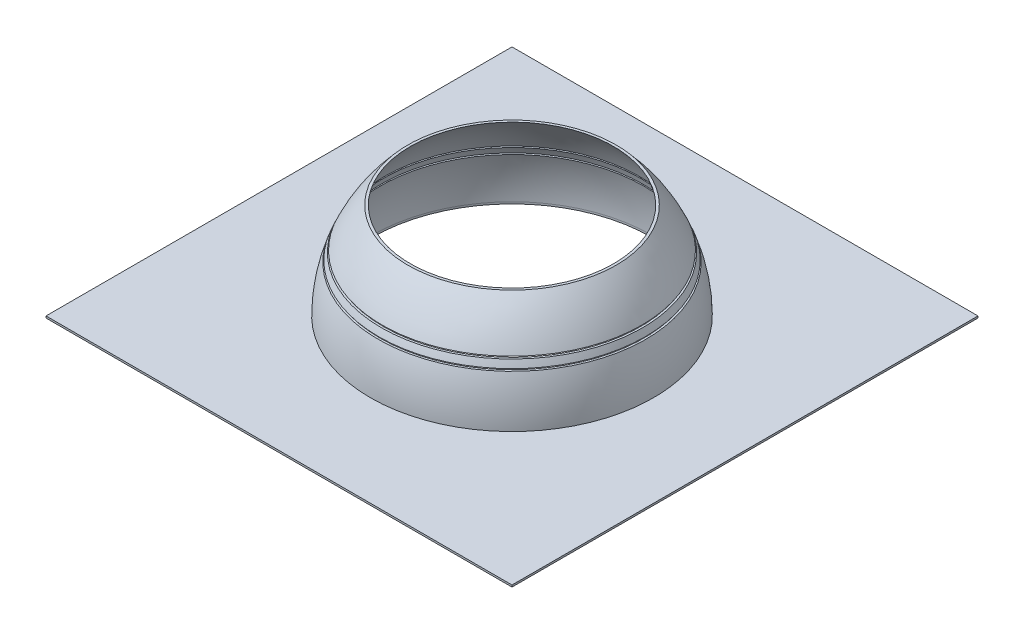
ISO-10303-21;
HEADER;
FILE_DESCRIPTION(('STEP AP214'),'2;1');
FILE_NAME('part.step','',(''),(''),'','','');
FILE_SCHEMA(('AUTOMOTIVE_DESIGN { 1 0 10303 214 1 1 1 1 }'));
ENDSEC;
DATA;
#1=APPLICATION_CONTEXT('core data for automotive mechanical design processes');
#2=APPLICATION_PROTOCOL_DEFINITION('international standard','automotive_design',2000,#1);
#3=PRODUCT_CONTEXT('',#1,'mechanical');
#4=PRODUCT('Part','Part','',(#3));
#5=PRODUCT_RELATED_PRODUCT_CATEGORY('part','',(#4));
#6=PRODUCT_DEFINITION_FORMATION('','',#4);
#7=PRODUCT_DEFINITION_CONTEXT('part definition',#1,'design');
#8=PRODUCT_DEFINITION('design','',#6,#7);
#9=PRODUCT_DEFINITION_SHAPE('','',#8);
#10=(LENGTH_UNIT() NAMED_UNIT(*) SI_UNIT(.MILLI.,.METRE.));
#11=(NAMED_UNIT(*) PLANE_ANGLE_UNIT() SI_UNIT($,.RADIAN.));
#12=(NAMED_UNIT(*) SI_UNIT($,.STERADIAN.) SOLID_ANGLE_UNIT());
#13=UNCERTAINTY_MEASURE_WITH_UNIT(LENGTH_MEASURE(1.E-05),#10,'distance_accuracy_value','');
#14=(GEOMETRIC_REPRESENTATION_CONTEXT(3) GLOBAL_UNCERTAINTY_ASSIGNED_CONTEXT((#13)) GLOBAL_UNIT_ASSIGNED_CONTEXT((#10,
#11,#12)) REPRESENTATION_CONTEXT('',''));
#15=CARTESIAN_POINT('',(0.,0.,0.));
#16=DIRECTION('',(0.,0.,1.));
#17=DIRECTION('',(1.,0.,0.));
#18=AXIS2_PLACEMENT_3D('',#15,#16,#17);
#19=CARTESIAN_POINT('',(0.,0.,0.));
#20=DIRECTION('',(0.,1.,0.));
#21=DIRECTION('',(-1.,0.,0.));
#22=AXIS2_PLACEMENT_3D('',#19,#20,#21);
#23=SPHERICAL_SURFACE('',#22,150.);
#24=CARTESIAN_POINT('',(0.,50.,0.));
#25=DIRECTION('',(0.,-1.,0.));
#26=DIRECTION('',(0.,0.,-1.));
#27=AXIS2_PLACEMENT_3D('',#24,#25,#26);
#28=CIRCLE('',#27,141.42135623731);
#29=CARTESIAN_POINT('',(0.,50.,-141.42135623731));
#30=VERTEX_POINT('',#29);
#31=EDGE_CURVE('E118',#30,#30,#28,.T.);
#32=ORIENTED_EDGE('',*,*,#31,.F.);
#33=EDGE_LOOP('',(#32));
#34=FACE_BOUND('',#33,.T.);
#35=CARTESIAN_POINT('',(0.,0.,0.));
#36=DIRECTION('',(0.,-1.,0.));
#37=DIRECTION('',(0.,0.,-1.));
#38=AXIS2_PLACEMENT_3D('',#35,#36,#37);
#39=CIRCLE('',#38,150.);
#40=CARTESIAN_POINT('',(0.,0.,150.));
#41=VERTEX_POINT('',#40);
#42=EDGE_CURVE('E125',#41,#41,#39,.T.);
#43=ORIENTED_EDGE('',*,*,#42,.T.);
#44=EDGE_LOOP('',(#43));
#45=FACE_BOUND('',#44,.T.);
#46=ADVANCED_FACE('F55',(#34,#45),#23,.F.);
#47=CARTESIAN_POINT('',(-228.314893880117,50.,-250.));
#48=DIRECTION('',(0.,-1.,0.));
#49=DIRECTION('',(0.,0.,-1.));
#50=AXIS2_PLACEMENT_3D('',#47,#48,#49);
#51=PLANE('',#50);
#52=CARTESIAN_POINT('',(0.,50.,0.));
#53=DIRECTION('',(0.,-1.,0.));
#54=DIRECTION('',(0.,0.,-1.));
#55=AXIS2_PLACEMENT_3D('',#52,#53,#54);
#56=CIRCLE('',#55,143.540934927985);
#57=CARTESIAN_POINT('',(0.,50.,-143.540934927985));
#58=VERTEX_POINT('',#57);
#59=EDGE_CURVE('E116',#58,#58,#56,.F.);
#60=ORIENTED_EDGE('',*,*,#59,.T.);
#61=EDGE_LOOP('',(#60));
#62=FACE_BOUND('',#61,.T.);
#63=ORIENTED_EDGE('',*,*,#31,.T.);
#64=EDGE_LOOP('',(#63));
#65=FACE_BOUND('',#64,.T.);
#66=ADVANCED_FACE('F162',(#62,#65),#51,.F.);
#67=CARTESIAN_POINT('',(0.,0.,0.));
#68=DIRECTION('',(0.,1.,0.));
#69=DIRECTION('',(1.,0.,0.));
#70=AXIS2_PLACEMENT_3D('',#67,#68,#69);
#71=SPHERICAL_SURFACE('',#70,152.);
#72=ORIENTED_EDGE('',*,*,#59,.F.);
#73=EDGE_LOOP('',(#72));
#74=FACE_BOUND('',#73,.T.);
#75=CARTESIAN_POINT('',(0.,0.,0.));
#76=DIRECTION('',(0.,1.,0.));
#77=DIRECTION('',(0.,0.,1.));
#78=AXIS2_PLACEMENT_3D('',#75,#76,#77);
#79=CIRCLE('',#78,152.);
#80=CARTESIAN_POINT('',(0.,0.,152.));
#81=VERTEX_POINT('',#80);
#82=EDGE_CURVE('E122',#81,#81,#79,.T.);
#83=ORIENTED_EDGE('',*,*,#82,.T.);
#84=EDGE_LOOP('',(#83));
#85=FACE_BOUND('',#84,.T.);
#86=ADVANCED_FACE('F57',(#74,#85),#71,.T.);
#87=CARTESIAN_POINT('',(0.,0.,0.));
#88=DIRECTION('',(0.,1.,0.));
#89=DIRECTION('',(0.,0.,1.));
#90=AXIS2_PLACEMENT_3D('',#87,#88,#89);
#91=PLANE('',#90);
#92=ORIENTED_EDGE('',*,*,#82,.F.);
#93=EDGE_LOOP('',(#92));
#94=FACE_BOUND('',#93,.T.);
#95=DIRECTION('',(0.,0.,-1.));
#96=VECTOR('',#95,1.);
#97=CARTESIAN_POINT('',(250.,0.,-250.));
#98=LINE('',#97,#96);
#99=CARTESIAN_POINT('',(250.,0.,250.));
#100=VERTEX_POINT('',#99);
#101=CARTESIAN_POINT('',(250.,0.,-250.));
#102=VERTEX_POINT('',#101);
#103=EDGE_CURVE('E134',#100,#102,#98,.T.);
#104=ORIENTED_EDGE('',*,*,#103,.T.);
#105=DIRECTION('',(-1.,0.,0.));
#106=VECTOR('',#105,1.);
#107=CARTESIAN_POINT('',(-250.,0.,-250.));
#108=LINE('',#107,#106);
#109=CARTESIAN_POINT('',(-250.,0.,-250.));
#110=VERTEX_POINT('',#109);
#111=EDGE_CURVE('E99',#102,#110,#108,.T.);
#112=ORIENTED_EDGE('',*,*,#111,.T.);
#113=DIRECTION('',(0.,0.,1.));
#114=VECTOR('',#113,1.);
#115=CARTESIAN_POINT('',(-250.,0.,-250.));
#116=LINE('',#115,#114);
#117=CARTESIAN_POINT('',(-250.,0.,250.));
#118=VERTEX_POINT('',#117);
#119=EDGE_CURVE('E141',#110,#118,#116,.T.);
#120=ORIENTED_EDGE('',*,*,#119,.T.);
#121=DIRECTION('',(1.,0.,0.));
#122=VECTOR('',#121,1.);
#123=CARTESIAN_POINT('',(-250.,0.,250.));
#124=LINE('',#123,#122);
#125=EDGE_CURVE('E107',#118,#100,#124,.T.);
#126=ORIENTED_EDGE('',*,*,#125,.T.);
#127=EDGE_LOOP('',(#104,#112,#120,#126));
#128=FACE_BOUND('',#127,.T.);
#129=ADVANCED_FACE('F151',(#94,#128),#91,.T.);
#130=CARTESIAN_POINT('',(0.,-2.,0.));
#131=DIRECTION('',(0.,1.,0.));
#132=DIRECTION('',(0.,0.,1.));
#133=AXIS2_PLACEMENT_3D('',#130,#131,#132);
#134=PLANE('',#133);
#135=CARTESIAN_POINT('',(0.,-2.,0.));
#136=DIRECTION('',(0.,1.,0.));
#137=DIRECTION('',(0.,0.,1.));
#138=AXIS2_PLACEMENT_3D('',#135,#136,#137);
#139=CIRCLE('',#138,150.);
#140=CARTESIAN_POINT('',(0.,-2.,150.));
#141=VERTEX_POINT('',#140);
#142=EDGE_CURVE('E59',#141,#141,#139,.F.);
#143=ORIENTED_EDGE('',*,*,#142,.F.);
#144=EDGE_LOOP('',(#143));
#145=FACE_BOUND('',#144,.T.);
#146=DIRECTION('',(0.,0.,-1.));
#147=VECTOR('',#146,1.);
#148=CARTESIAN_POINT('',(250.,-2.,-250.));
#149=LINE('',#148,#147);
#150=CARTESIAN_POINT('',(250.,-2.,250.));
#151=VERTEX_POINT('',#150);
#152=CARTESIAN_POINT('',(250.,-2.,-250.));
#153=VERTEX_POINT('',#152);
#154=EDGE_CURVE('E65',#151,#153,#149,.T.);
#155=ORIENTED_EDGE('',*,*,#154,.F.);
#156=DIRECTION('',(1.,0.,0.));
#157=VECTOR('',#156,1.);
#158=CARTESIAN_POINT('',(-250.,-2.,250.));
#159=LINE('',#158,#157);
#160=CARTESIAN_POINT('',(-250.,-2.,250.));
#161=VERTEX_POINT('',#160);
#162=EDGE_CURVE('E113',#161,#151,#159,.T.);
#163=ORIENTED_EDGE('',*,*,#162,.F.);
#164=DIRECTION('',(0.,0.,1.));
#165=VECTOR('',#164,1.);
#166=CARTESIAN_POINT('',(-250.,-2.,-250.));
#167=LINE('',#166,#165);
#168=CARTESIAN_POINT('',(-250.,-2.,-250.));
#169=VERTEX_POINT('',#168);
#170=EDGE_CURVE('E106',#169,#161,#167,.T.);
#171=ORIENTED_EDGE('',*,*,#170,.F.);
#172=DIRECTION('',(-1.,0.,0.));
#173=VECTOR('',#172,1.);
#174=CARTESIAN_POINT('',(-250.,-2.,-250.));
#175=LINE('',#174,#173);
#176=EDGE_CURVE('E97',#153,#169,#175,.T.);
#177=ORIENTED_EDGE('',*,*,#176,.F.);
#178=EDGE_LOOP('',(#155,#163,#171,#177));
#179=FACE_BOUND('',#178,.T.);
#180=ADVANCED_FACE('F103',(#145,#179),#134,.F.);
#181=CARTESIAN_POINT('',(-250.,-2.,-250.));
#182=DIRECTION('',(0.,0.,-1.));
#183=DIRECTION('',(-1.,0.,0.));
#184=AXIS2_PLACEMENT_3D('',#181,#182,#183);
#185=PLANE('',#184);
#186=ORIENTED_EDGE('',*,*,#111,.F.);
#187=DIRECTION('',(0.,1.,0.));
#188=VECTOR('',#187,1.);
#189=CARTESIAN_POINT('',(250.,-2.,-250.));
#190=LINE('',#189,#188);
#191=EDGE_CURVE('E12',#153,#102,#190,.T.);
#192=ORIENTED_EDGE('',*,*,#191,.F.);
#193=ORIENTED_EDGE('',*,*,#176,.T.);
#194=DIRECTION('',(0.,1.,0.));
#195=VECTOR('',#194,1.);
#196=CARTESIAN_POINT('',(-250.,-2.,-250.));
#197=LINE('',#196,#195);
#198=EDGE_CURVE('E90',#169,#110,#197,.T.);
#199=ORIENTED_EDGE('',*,*,#198,.T.);
#200=EDGE_LOOP('',(#186,#192,#193,#199));
#201=FACE_BOUND('',#200,.T.);
#202=ADVANCED_FACE('F96',(#201),#185,.T.);
#203=CARTESIAN_POINT('',(-250.,-2.,-250.));
#204=DIRECTION('',(-1.,0.,0.));
#205=DIRECTION('',(0.,0.,1.));
#206=AXIS2_PLACEMENT_3D('',#203,#204,#205);
#207=PLANE('',#206);
#208=ORIENTED_EDGE('',*,*,#119,.F.);
#209=ORIENTED_EDGE('',*,*,#198,.F.);
#210=ORIENTED_EDGE('',*,*,#170,.T.);
#211=DIRECTION('',(0.,1.,0.));
#212=VECTOR('',#211,1.);
#213=CARTESIAN_POINT('',(-250.,-2.,250.));
#214=LINE('',#213,#212);
#215=EDGE_CURVE('E137',#161,#118,#214,.T.);
#216=ORIENTED_EDGE('',*,*,#215,.T.);
#217=EDGE_LOOP('',(#208,#209,#210,#216));
#218=FACE_BOUND('',#217,.T.);
#219=ADVANCED_FACE('F146',(#218),#207,.T.);
#220=CARTESIAN_POINT('',(-250.,-2.,250.));
#221=DIRECTION('',(0.,0.,1.));
#222=DIRECTION('',(1.,0.,0.));
#223=AXIS2_PLACEMENT_3D('',#220,#221,#222);
#224=PLANE('',#223);
#225=ORIENTED_EDGE('',*,*,#125,.F.);
#226=ORIENTED_EDGE('',*,*,#215,.F.);
#227=ORIENTED_EDGE('',*,*,#162,.T.);
#228=DIRECTION('',(0.,1.,0.));
#229=VECTOR('',#228,1.);
#230=CARTESIAN_POINT('',(250.,-2.,250.));
#231=LINE('',#230,#229);
#232=EDGE_CURVE('E111',#151,#100,#231,.T.);
#233=ORIENTED_EDGE('',*,*,#232,.T.);
#234=EDGE_LOOP('',(#225,#226,#227,#233));
#235=FACE_BOUND('',#234,.T.);
#236=ADVANCED_FACE('F149',(#235),#224,.T.);
#237=CARTESIAN_POINT('',(250.,-2.,-250.));
#238=DIRECTION('',(1.,0.,0.));
#239=DIRECTION('',(0.,0.,-1.));
#240=AXIS2_PLACEMENT_3D('',#237,#238,#239);
#241=PLANE('',#240);
#242=ORIENTED_EDGE('',*,*,#103,.F.);
#243=ORIENTED_EDGE('',*,*,#232,.F.);
#244=ORIENTED_EDGE('',*,*,#154,.T.);
#245=ORIENTED_EDGE('',*,*,#191,.T.);
#246=EDGE_LOOP('',(#242,#243,#244,#245));
#247=FACE_BOUND('',#246,.T.);
#248=ADVANCED_FACE('F109',(#247),#241,.T.);
#249=CARTESIAN_POINT('',(0.,-2.000012,0.));
#250=DIRECTION('',(0.,1.,0.));
#251=DIRECTION('',(0.,0.,1.));
#252=AXIS2_PLACEMENT_3D('',#249,#250,#251);
#253=CYLINDRICAL_SURFACE('',#252,150.);
#254=CARTESIAN_POINT('',(0.,0.,150.));
#255=CARTESIAN_POINT('',(0.,-0.0208333333333333,150.));
#256=CARTESIAN_POINT('',(0.,-0.0416666666666666,150.));
#257=CARTESIAN_POINT('',(0.,-0.0833333333333332,150.));
#258=CARTESIAN_POINT('',(0.,-0.104166666666667,150.));
#259=CARTESIAN_POINT('',(0.,-0.145833333333333,150.));
#260=CARTESIAN_POINT('',(0.,-0.166666666666667,150.));
#261=CARTESIAN_POINT('',(0.,-0.208333333333333,150.));
#262=CARTESIAN_POINT('',(0.,-0.229166666666667,150.));
#263=CARTESIAN_POINT('',(0.,-0.270833333333333,150.));
#264=CARTESIAN_POINT('',(0.,-0.291666666666667,150.));
#265=CARTESIAN_POINT('',(0.,-0.333333333333333,150.));
#266=CARTESIAN_POINT('',(0.,-0.354166666666667,150.));
#267=CARTESIAN_POINT('',(0.,-0.395833333333333,150.));
#268=CARTESIAN_POINT('',(0.,-0.416666666666667,150.));
#269=CARTESIAN_POINT('',(0.,-0.458333333333333,150.));
#270=CARTESIAN_POINT('',(0.,-0.479166666666667,150.));
#271=CARTESIAN_POINT('',(0.,-0.520833333333333,150.));
#272=CARTESIAN_POINT('',(0.,-0.541666666666667,150.));
#273=CARTESIAN_POINT('',(0.,-0.583333333333333,150.));
#274=CARTESIAN_POINT('',(0.,-0.604166666666667,150.));
#275=CARTESIAN_POINT('',(0.,-0.645833333333333,150.));
#276=CARTESIAN_POINT('',(0.,-0.666666666666667,150.));
#277=CARTESIAN_POINT('',(0.,-0.708333333333333,150.));
#278=CARTESIAN_POINT('',(0.,-0.729166666666667,150.));
#279=CARTESIAN_POINT('',(0.,-0.770833333333333,150.));
#280=CARTESIAN_POINT('',(0.,-0.791666666666667,150.));
#281=CARTESIAN_POINT('',(0.,-0.833333333333333,150.));
#282=CARTESIAN_POINT('',(0.,-0.854166666666667,150.));
#283=CARTESIAN_POINT('',(0.,-0.895833333333333,150.));
#284=CARTESIAN_POINT('',(0.,-0.916666666666667,150.));
#285=CARTESIAN_POINT('',(0.,-0.958333333333333,150.));
#286=CARTESIAN_POINT('',(0.,-0.979166666666667,150.));
#287=CARTESIAN_POINT('',(0.,-1.02083333333333,150.));
#288=CARTESIAN_POINT('',(0.,-1.04166666666667,150.));
#289=CARTESIAN_POINT('',(0.,-1.08333333333333,150.));
#290=CARTESIAN_POINT('',(0.,-1.10416666666667,150.));
#291=CARTESIAN_POINT('',(0.,-1.14583333333333,150.));
#292=CARTESIAN_POINT('',(0.,-1.16666666666667,150.));
#293=CARTESIAN_POINT('',(0.,-1.20833333333333,150.));
#294=CARTESIAN_POINT('',(0.,-1.22916666666667,150.));
#295=CARTESIAN_POINT('',(0.,-1.27083333333333,150.));
#296=CARTESIAN_POINT('',(0.,-1.29166666666667,150.));
#297=CARTESIAN_POINT('',(0.,-1.33333333333333,150.));
#298=CARTESIAN_POINT('',(0.,-1.35416666666667,150.));
#299=CARTESIAN_POINT('',(0.,-1.39583333333333,150.));
#300=CARTESIAN_POINT('',(0.,-1.41666666666667,150.));
#301=CARTESIAN_POINT('',(0.,-1.45833333333333,150.));
#302=CARTESIAN_POINT('',(0.,-1.47916666666667,150.));
#303=CARTESIAN_POINT('',(0.,-1.52083333333333,150.));
#304=CARTESIAN_POINT('',(0.,-1.54166666666667,150.));
#305=CARTESIAN_POINT('',(0.,-1.58333333333333,150.));
#306=CARTESIAN_POINT('',(0.,-1.60416666666667,150.));
#307=CARTESIAN_POINT('',(0.,-1.64583333333333,150.));
#308=CARTESIAN_POINT('',(0.,-1.66666666666667,150.));
#309=CARTESIAN_POINT('',(0.,-1.70833333333333,150.));
#310=CARTESIAN_POINT('',(0.,-1.72916666666667,150.));
#311=CARTESIAN_POINT('',(0.,-1.77083333333333,150.));
#312=CARTESIAN_POINT('',(0.,-1.79166666666667,150.));
#313=CARTESIAN_POINT('',(0.,-1.83333333333333,150.));
#314=CARTESIAN_POINT('',(0.,-1.85416666666667,150.));
#315=CARTESIAN_POINT('',(0.,-1.89583333333333,150.));
#316=CARTESIAN_POINT('',(0.,-1.91666666666667,150.));
#317=CARTESIAN_POINT('',(0.,-1.95833333333333,150.));
#318=CARTESIAN_POINT('',(0.,-1.97916666666667,150.));
#319=CARTESIAN_POINT('',(0.,-2.,150.));
#320=B_SPLINE_CURVE_WITH_KNOTS('',3,(#254,#255,#256,#257,#258,#259,#260,#261,#262,#263,#264,
#265,#266,#267,#268,#269,#270,#271,#272,#273,#274,#275,#276,#277,#278,#279,#280,#281,#282,#283,
#284,#285,#286,#287,#288,#289,#290,#291,#292,#293,#294,#295,#296,#297,#298,#299,#300,#301,#302,
#303,#304,#305,#306,#307,#308,#309,#310,#311,#312,#313,#314,#315,#316,#317,#318,#319),
.UNSPECIFIED.,.F.,.F.,(4,2,2,2,2,2,2,2,2,2,2,2,2,2,2,2,2,2,2,2,2,2,2,2,2,2,2,2,2,2,2,2,4),(0.,
0.0624999999999998,0.125,0.1875,0.25,0.3125,0.375,0.4375,0.5,0.5625,0.625,0.6875,0.75,0.8125,
0.875,0.9375,1.,1.0625,1.125,1.1875,1.25,1.3125,1.375,1.4375,1.5,1.5625,1.625,1.6875,1.75,
1.8125,1.875,1.9375,2.),.UNSPECIFIED.);
#321=EDGE_CURVE('BSEAM223',#41,#141,#320,.T.);
#322=ORIENTED_EDGE('',*,*,#42,.F.);
#323=ORIENTED_EDGE('',*,*,#142,.T.);
#324=ORIENTED_EDGE('',*,*,#321,.T.);
#325=ORIENTED_EDGE('',*,*,#321,.F.);
#326=EDGE_LOOP('',(#322,#324,#323,#325));
#327=FACE_BOUND('',#326,.T.);
#328=ADVANCED_FACE('F223',(#327),#253,.F.);
#329=CLOSED_SHELL('',(#46,#66,#86,#129,#180,#202,#219,#236,#248,#328));
#330=MANIFOLD_SOLID_BREP('B2',#329);
#331=CARTESIAN_POINT('',(0.,0.,0.));
#332=DIRECTION('',(0.,1.,0.));
#333=DIRECTION('',(-1.,0.,0.));
#334=AXIS2_PLACEMENT_3D('',#331,#332,#333);
#335=SPHERICAL_SURFACE('',#334,150.);
#336=CARTESIAN_POINT('',(26.3113522446042,0.,0.));
#337=DIRECTION('',(1.,0.,0.));
#338=DIRECTION('',(0.,0.,-1.));
#339=AXIS2_PLACEMENT_3D('',#336,#337,#338);
#340=CIRCLE('',#339,147.674346936292);
#341=CARTESIAN_POINT('',(26.3113522446042,53.5,-137.642517933451));
#342=VERTEX_POINT('',#341);
#343=CARTESIAN_POINT('',(26.3113522446042,57.5,-136.020082131501));
#344=VERTEX_POINT('',#343);
#345=EDGE_CURVE('E353',#342,#344,#340,.T.);
#346=ORIENTED_EDGE('',*,*,#345,.F.);
#347=CARTESIAN_POINT('',(0.,53.5,0.));
#348=DIRECTION('',(0.,-1.,0.));
#349=DIRECTION('',(0.,0.,-1.));
#350=AXIS2_PLACEMENT_3D('',#347,#348,#349);
#351=CIRCLE('',#350,140.134756573806);
#352=CARTESIAN_POINT('',(11.3113522446042,53.5,-139.677497509078));
#353=VERTEX_POINT('',#352);
#354=EDGE_CURVE('E375',#353,#342,#351,.T.);
#355=ORIENTED_EDGE('',*,*,#354,.F.);
#356=CARTESIAN_POINT('',(11.3113522446042,0.,0.));
#357=DIRECTION('',(-1.,0.,0.));
#358=DIRECTION('',(0.,0.,1.));
#359=AXIS2_PLACEMENT_3D('',#356,#357,#358);
#360=CIRCLE('',#359,149.572902995156);
#361=CARTESIAN_POINT('',(11.3113522446042,57.5,-138.07897490349));
#362=VERTEX_POINT('',#361);
#363=EDGE_CURVE('E377',#362,#353,#360,.T.);
#364=ORIENTED_EDGE('',*,*,#363,.F.);
#365=CARTESIAN_POINT('',(0.,57.5,0.));
#366=DIRECTION('',(0.,1.,0.));
#367=DIRECTION('',(0.,0.,1.));
#368=AXIS2_PLACEMENT_3D('',#365,#366,#367);
#369=CIRCLE('',#368,138.541510024974);
#370=EDGE_CURVE('E379',#344,#362,#369,.T.);
#371=ORIENTED_EDGE('',*,*,#370,.F.);
#372=EDGE_LOOP('',(#346,#355,#364,#371));
#373=FACE_BOUND('',#372,.T.);
#374=CARTESIAN_POINT('',(0.,59.,0.));
#375=DIRECTION('',(0.,-1.,0.));
#376=DIRECTION('',(0.,0.,-1.));
#377=AXIS2_PLACEMENT_3D('',#374,#375,#376);
#378=CIRCLE('',#377,137.909390543211);
#379=CARTESIAN_POINT('',(0.,59.,-137.909390543211));
#380=VERTEX_POINT('',#379);
#381=EDGE_CURVE('E346',#380,#380,#378,.T.);
#382=ORIENTED_EDGE('',*,*,#381,.F.);
#383=EDGE_LOOP('',(#382));
#384=FACE_BOUND('',#383,.T.);
#385=CARTESIAN_POINT('',(0.,52.,0.));
#386=DIRECTION('',(0.,1.,0.));
#387=DIRECTION('',(0.,0.,1.));
#388=AXIS2_PLACEMENT_3D('',#385,#386,#387);
#389=CIRCLE('',#388,140.698258695692);
#390=CARTESIAN_POINT('',(0.,52.,140.698258695692));
#391=VERTEX_POINT('',#390);
#392=EDGE_CURVE('E366',#391,#391,#389,.T.);
#393=ORIENTED_EDGE('',*,*,#392,.F.);
#394=EDGE_LOOP('',(#393));
#395=FACE_BOUND('',#394,.T.);
#396=ADVANCED_FACE('F303',(#373,#384,#395),#335,.F.);
#397=CARTESIAN_POINT('',(-228.314893880117,52.,-250.));
#398=DIRECTION('',(0.,1.,0.));
#399=DIRECTION('',(0.,0.,1.));
#400=AXIS2_PLACEMENT_3D('',#397,#398,#399);
#401=PLANE('',#400);
#402=CARTESIAN_POINT('',(0.,52.,0.));
#403=DIRECTION('',(0.,1.,0.));
#404=DIRECTION('',(0.,0.,1.));
#405=AXIS2_PLACEMENT_3D('',#402,#403,#404);
#406=CIRCLE('',#405,142.828568570857);
#407=CARTESIAN_POINT('',(0.,52.,142.828568570857));
#408=VERTEX_POINT('',#407);
#409=EDGE_CURVE('E363',#408,#408,#406,.F.);
#410=ORIENTED_EDGE('',*,*,#409,.T.);
#411=EDGE_LOOP('',(#410));
#412=FACE_BOUND('',#411,.T.);
#413=ORIENTED_EDGE('',*,*,#392,.T.);
#414=EDGE_LOOP('',(#413));
#415=FACE_BOUND('',#414,.T.);
#416=ADVANCED_FACE('F401',(#412,#415),#401,.F.);
#417=CARTESIAN_POINT('',(-217.285188861754,59.,-250.));
#418=DIRECTION('',(0.,-1.,0.));
#419=DIRECTION('',(0.,0.,-1.));
#420=AXIS2_PLACEMENT_3D('',#417,#418,#419);
#421=PLANE('',#420);
#422=CARTESIAN_POINT('',(0.,59.,0.));
#423=DIRECTION('',(0.,-1.,0.));
#424=DIRECTION('',(0.,0.,-1.));
#425=AXIS2_PLACEMENT_3D('',#422,#423,#424);
#426=CIRCLE('',#425,140.08211877324);
#427=CARTESIAN_POINT('',(0.,59.,-140.08211877324));
#428=VERTEX_POINT('',#427);
#429=EDGE_CURVE('E367',#428,#428,#426,.F.);
#430=ORIENTED_EDGE('',*,*,#429,.T.);
#431=EDGE_LOOP('',(#430));
#432=FACE_BOUND('',#431,.T.);
#433=ORIENTED_EDGE('',*,*,#381,.T.);
#434=EDGE_LOOP('',(#433));
#435=FACE_BOUND('',#434,.T.);
#436=ADVANCED_FACE('F405',(#432,#435),#421,.F.);
#437=CARTESIAN_POINT('',(0.,0.,0.));
#438=DIRECTION('',(0.,1.,0.));
#439=DIRECTION('',(1.,0.,0.));
#440=AXIS2_PLACEMENT_3D('',#437,#438,#439);
#441=SPHERICAL_SURFACE('',#440,152.);
#442=CARTESIAN_POINT('',(26.3113522446042,0.,0.));
#443=DIRECTION('',(1.,0.,0.));
#444=DIRECTION('',(0.,0.,-1.));
#445=AXIS2_PLACEMENT_3D('',#442,#443,#444);
#446=CIRCLE('',#445,149.705419885388);
#447=CARTESIAN_POINT('',(26.3113522446042,57.5,-138.222511708695));
#448=VERTEX_POINT('',#447);
#449=CARTESIAN_POINT('',(26.3113522446042,53.5,-139.819393301002));
#450=VERTEX_POINT('',#449);
#451=EDGE_CURVE('E53',#448,#450,#446,.F.);
#452=ORIENTED_EDGE('',*,*,#451,.F.);
#453=CARTESIAN_POINT('',(0.,57.5,0.));
#454=DIRECTION('',(0.,1.,0.));
#455=DIRECTION('',(0.,0.,1.));
#456=AXIS2_PLACEMENT_3D('',#453,#454,#455);
#457=CIRCLE('',#456,140.704477540695);
#458=CARTESIAN_POINT('',(11.3113522446042,57.5,-140.249075969856));
#459=VERTEX_POINT('',#458);
#460=EDGE_CURVE('E340',#459,#448,#457,.F.);
#461=ORIENTED_EDGE('',*,*,#460,.F.);
#462=CARTESIAN_POINT('',(11.3113522446042,0.,0.));
#463=DIRECTION('',(-1.,0.,0.));
#464=DIRECTION('',(0.,0.,1.));
#465=AXIS2_PLACEMENT_3D('',#462,#463,#464);
#466=CIRCLE('',#465,151.578538422821);
#467=CARTESIAN_POINT('',(11.3113522446042,53.5,-141.8231409552));
#468=VERTEX_POINT('',#467);
#469=EDGE_CURVE('E345',#468,#459,#466,.F.);
#470=ORIENTED_EDGE('',*,*,#469,.F.);
#471=CARTESIAN_POINT('',(0.,53.5,0.));
#472=DIRECTION('',(0.,-1.,0.));
#473=DIRECTION('',(0.,0.,-1.));
#474=AXIS2_PLACEMENT_3D('',#471,#472,#473);
#475=CIRCLE('',#474,142.273504209322);
#476=EDGE_CURVE('E311',#450,#468,#475,.F.);
#477=ORIENTED_EDGE('',*,*,#476,.F.);
#478=EDGE_LOOP('',(#452,#461,#470,#477));
#479=FACE_BOUND('',#478,.T.);
#480=ORIENTED_EDGE('',*,*,#429,.F.);
#481=EDGE_LOOP('',(#480));
#482=FACE_BOUND('',#481,.T.);
#483=ORIENTED_EDGE('',*,*,#409,.F.);
#484=EDGE_LOOP('',(#483));
#485=FACE_BOUND('',#484,.T.);
#486=ADVANCED_FACE('F305',(#479,#482,#485),#441,.T.);
#487=CARTESIAN_POINT('',(26.3113522446042,57.5,-150.));
#488=DIRECTION('',(1.,0.,0.));
#489=DIRECTION('',(0.,0.,-1.));
#490=AXIS2_PLACEMENT_3D('',#487,#488,#489);
#491=PLANE('',#490);
#492=ORIENTED_EDGE('',*,*,#345,.T.);
#493=DIRECTION('',(0.,0.,1.));
#494=VECTOR('',#493,1.);
#495=CARTESIAN_POINT('',(26.3113522446042,57.5,-150.));
#496=LINE('',#495,#494);
#497=EDGE_CURVE('E318',#448,#344,#496,.T.);
#498=ORIENTED_EDGE('',*,*,#497,.F.);
#499=ORIENTED_EDGE('',*,*,#451,.T.);
#500=DIRECTION('',(0.,0.,1.));
#501=VECTOR('',#500,1.);
#502=CARTESIAN_POINT('',(26.3113522446042,53.5,-150.));
#503=LINE('',#502,#501);
#504=EDGE_CURVE('E380',#450,#342,#503,.T.);
#505=ORIENTED_EDGE('',*,*,#504,.T.);
#506=EDGE_LOOP('',(#492,#498,#499,#505));
#507=FACE_BOUND('',#506,.T.);
#508=ADVANCED_FACE('F349',(#507),#491,.F.);
#509=CARTESIAN_POINT('',(26.3113522446042,53.5,-150.));
#510=DIRECTION('',(0.,-1.,0.));
#511=DIRECTION('',(0.,0.,-1.));
#512=AXIS2_PLACEMENT_3D('',#509,#510,#511);
#513=PLANE('',#512);
#514=ORIENTED_EDGE('',*,*,#354,.T.);
#515=ORIENTED_EDGE('',*,*,#504,.F.);
#516=ORIENTED_EDGE('',*,*,#476,.T.);
#517=DIRECTION('',(0.,0.,1.));
#518=VECTOR('',#517,1.);
#519=CARTESIAN_POINT('',(11.3113522446042,53.5,-150.));
#520=LINE('',#519,#518);
#521=EDGE_CURVE('E383',#468,#353,#520,.T.);
#522=ORIENTED_EDGE('',*,*,#521,.T.);
#523=EDGE_LOOP('',(#514,#515,#516,#522));
#524=FACE_BOUND('',#523,.T.);
#525=ADVANCED_FACE('F391',(#524),#513,.F.);
#526=CARTESIAN_POINT('',(11.3113522446042,57.5,-150.));
#527=DIRECTION('',(-1.,0.,0.));
#528=DIRECTION('',(0.,0.,1.));
#529=AXIS2_PLACEMENT_3D('',#526,#527,#528);
#530=PLANE('',#529);
#531=ORIENTED_EDGE('',*,*,#363,.T.);
#532=ORIENTED_EDGE('',*,*,#521,.F.);
#533=ORIENTED_EDGE('',*,*,#469,.T.);
#534=DIRECTION('',(0.,0.,1.));
#535=VECTOR('',#534,1.);
#536=CARTESIAN_POINT('',(11.3113522446042,57.5,-150.));
#537=LINE('',#536,#535);
#538=EDGE_CURVE('E323',#459,#362,#537,.T.);
#539=ORIENTED_EDGE('',*,*,#538,.T.);
#540=EDGE_LOOP('',(#531,#532,#533,#539));
#541=FACE_BOUND('',#540,.T.);
#542=ADVANCED_FACE('F390',(#541),#530,.F.);
#543=CARTESIAN_POINT('',(26.3113522446042,57.5,-150.));
#544=DIRECTION('',(0.,1.,0.));
#545=DIRECTION('',(0.,0.,1.));
#546=AXIS2_PLACEMENT_3D('',#543,#544,#545);
#547=PLANE('',#546);
#548=ORIENTED_EDGE('',*,*,#370,.T.);
#549=ORIENTED_EDGE('',*,*,#538,.F.);
#550=ORIENTED_EDGE('',*,*,#460,.T.);
#551=ORIENTED_EDGE('',*,*,#497,.T.);
#552=EDGE_LOOP('',(#548,#549,#550,#551));
#553=FACE_BOUND('',#552,.T.);
#554=ADVANCED_FACE('F341',(#553),#547,.F.);
#555=CLOSED_SHELL('',(#396,#416,#436,#486,#508,#525,#542,#554));
#556=MANIFOLD_SOLID_BREP('B6',#555);
#557=CARTESIAN_POINT('',(0.,0.,0.));
#558=DIRECTION('',(0.,1.,0.));
#559=DIRECTION('',(-1.,0.,0.));
#560=AXIS2_PLACEMENT_3D('',#557,#558,#559);
#561=SPHERICAL_SURFACE('',#560,150.);
#562=CARTESIAN_POINT('',(0.,103.,0.));
#563=DIRECTION('',(0.,-1.,0.));
#564=DIRECTION('',(0.,0.,-1.));
#565=AXIS2_PLACEMENT_3D('',#562,#563,#564);
#566=CIRCLE('',#565,109.045861911399);
#567=CARTESIAN_POINT('',(-109.045861911399,103.,0.));
#568=VERTEX_POINT('',#567);
#569=EDGE_CURVE('E512',#568,#568,#566,.T.);
#570=CARTESIAN_POINT('',(0.,61.,0.));
#571=DIRECTION('',(0.,1.,0.));
#572=DIRECTION('',(0.,0.,1.));
#573=AXIS2_PLACEMENT_3D('',#570,#571,#572);
#574=CIRCLE('',#573,137.036491490406);
#575=CARTESIAN_POINT('',(-137.036491490406,61.,0.));
#576=VERTEX_POINT('',#575);
#577=EDGE_CURVE('E507',#576,#576,#574,.T.);
#578=CARTESIAN_POINT('',(-109.045861911399,103.,0.));
#579=CARTESIAN_POINT('',(-109.408605906627,102.615963933657,0.));
#580=CARTESIAN_POINT('',(-109.769321001311,102.230011458519,0.));
#581=CARTESIAN_POINT('',(-110.486653485254,101.454317106478,0.));
#582=CARTESIAN_POINT('',(-110.843270874514,101.064575229576,0.));
#583=CARTESIAN_POINT('',(-111.552368043273,100.28134548984,0.));
#584=CARTESIAN_POINT('',(-111.904847822772,99.8878576270055,0.));
#585=CARTESIAN_POINT('',(-112.6056304521,99.0971798627223,0.));
#586=CARTESIAN_POINT('',(-112.953933301929,98.6999899612738,0.));
#587=CARTESIAN_POINT('',(-113.646323185419,97.9019524499553,0.));
#588=CARTESIAN_POINT('',(-113.99041021908,97.5011048400854,0.));
#589=CARTESIAN_POINT('',(-114.674330063129,96.6957966585481,0.));
#590=CARTESIAN_POINT('',(-115.014162873518,96.2913360868809,0.));
#591=CARTESIAN_POINT('',(-115.68953633644,95.4788471294923,0.));
#592=CARTESIAN_POINT('',(-116.025076988974,95.070818743771,0.));
#593=CARTESIAN_POINT('',(-116.691828681354,94.2512397048616,0.));
#594=CARTESIAN_POINT('',(-117.023039721199,93.8396890516735,0.));
#595=CARTESIAN_POINT('',(-117.681095216494,93.013111417437,0.));
#596=CARTESIAN_POINT('',(-118.007939671942,92.5980844363886,0.));
#597=CARTESIAN_POINT('',(-118.657225514204,91.7646004741273,0.));
#598=CARTESIAN_POINT('',(-118.979666901017,91.3461434929145,0.));
#599=CARTESIAN_POINT('',(-119.620110613251,90.5058462408855,0.));
#600=CARTESIAN_POINT('',(-119.938112938672,90.0840059700693,0.));
#601=CARTESIAN_POINT('',(-120.569643030884,89.2369892270596,0.));
#602=CARTESIAN_POINT('',(-120.883170797674,88.8118127548661,0.));
#603=CARTESIAN_POINT('',(-121.505716774861,87.9581710697331,0.));
#604=CARTESIAN_POINT('',(-121.814734985257,87.5297058567936,0.));
#605=CARTESIAN_POINT('',(-122.428227355272,86.669534517908,0.));
#606=CARTESIAN_POINT('',(-122.732701514892,86.2378283919619,0.));
#607=CARTESIAN_POINT('',(-123.337071796207,85.371223416572,0.));
#608=CARTESIAN_POINT('',(-123.636967917903,84.9363245671281,0.));
#609=CARTESIAN_POINT('',(-124.232148647248,84.0633826906413,0.));
#610=CARTESIAN_POINT('',(-124.527433254897,83.6253396635984,0.));
#611=CARTESIAN_POINT('',(-125.113357994792,82.7461583287835,0.));
#612=CARTESIAN_POINT('',(-125.403998127037,82.3050200210114,0.));
#613=CARTESIAN_POINT('',(-125.980601473209,81.4196973671211,0.));
#614=CARTESIAN_POINT('',(-126.266564687135,80.9755130210028,0.));
#615=CARTESIAN_POINT('',(-126.833782275818,80.0841478728189,0.));
#616=CARTESIAN_POINT('',(-127.115036650574,79.6369670707534,0.));
#617=CARTESIAN_POINT('',(-127.672805165694,78.7396589275558,0.));
#618=CARTESIAN_POINT('',(-127.949319306057,78.2895315864237,0.));
#619=CARTESIAN_POINT('',(-128.4975764863,77.3863806108831,0.));
#620=CARTESIAN_POINT('',(-128.76931952618,76.9333569764747,0.));
#621=CARTESIAN_POINT('',(-129.308004171941,76.0244639834724,0.));
#622=CARTESIAN_POINT('',(-129.574945777823,75.5685946248787,0.));
#623=CARTESIAN_POINT('',(-130.10399775804,74.6540610702527,0.));
#624=CARTESIAN_POINT('',(-130.366108132374,74.1953968742204,0.));
#625=CARTESIAN_POINT('',(-130.885468391237,73.2753248434414,0.));
#626=CARTESIAN_POINT('',(-131.142718275766,72.8139170086948,0.));
#627=CARTESIAN_POINT('',(-131.652328839302,71.8884092054652,0.));
#628=CARTESIAN_POINT('',(-131.90468951831,71.4243092369822,0.));
#629=CARTESIAN_POINT('',(-132.404493500904,70.4934689717951,0.));
#630=CARTESIAN_POINT('',(-132.651936804491,70.026728675091,0.));
#631=CARTESIAN_POINT('',(-133.141878415041,69.0906598536093,0.));
#632=CARTESIAN_POINT('',(-133.384376722004,68.6213313288316,0.));
#633=CARTESIAN_POINT('',(-133.864401270874,67.6801384406216,0.));
#634=CARTESIAN_POINT('',(-134.101927512782,67.2082740771893,0.));
#635=CARTESIAN_POINT('',(-134.571981415199,66.2620621828164,0.));
#636=CARTESIAN_POINT('',(-134.804509075709,65.7877146518759,0.));
#637=CARTESIAN_POINT('',(-135.264539867858,64.8365893758084,0.));
#638=CARTESIAN_POINT('',(-135.492042999497,64.3598116306813,0.));
#639=CARTESIAN_POINT('',(-135.941999306627,63.4038791322153,0.));
#640=CARTESIAN_POINT('',(-136.164452482118,62.9247243788765,0.));
#641=CARTESIAN_POINT('',(-136.604284165162,61.964091404792,0.));
#642=CARTESIAN_POINT('',(-136.821662672715,61.4826131840464,0.));
#643=CARTESIAN_POINT('',(-137.036491490406,61.,0.));
#644=B_SPLINE_CURVE_WITH_KNOTS('',3,(#578,#579,#580,#581,#582,#583,#584,#585,#586,#587,#588,
#589,#590,#591,#592,#593,#594,#595,#596,#597,#598,#599,#600,#601,#602,#603,#604,#605,#606,#607,
#608,#609,#610,#611,#612,#613,#614,#615,#616,#617,#618,#619,#620,#621,#622,#623,#624,#625,#626,
#627,#628,#629,#630,#631,#632,#633,#634,#635,#636,#637,#638,#639,#640,#641,#642,#643),
.UNSPECIFIED.,.F.,.F.,(4,2,2,2,2,2,2,2,2,2,2,2,2,2,2,2,2,2,2,2,2,2,2,2,2,2,2,2,2,2,2,2,4),(0.,
1.58479613282778,3.16959226565552,4.75438839848328,6.33918453131104,7.92398066413881,
9.50877679696658,11.0935729297943,12.6783690626221,14.2631651954499,15.8479613282776,
17.4327574611054,19.0175535939332,20.6023497267609,22.1871458595887,23.7719419924164,
25.3567381252442,26.9415342580719,28.5263303908997,30.1111265237275,31.6959226565552,
33.280718789383,34.8655149222108,36.4503110550385,38.0351071878663,39.6199033206941,
41.2046994535218,42.7894955863496,44.3742917191773,45.9590878520051,47.5438839848329,
49.1286801176606,50.7134762504884),.UNSPECIFIED.);
#645=EDGE_CURVE('BSEAM500',#568,#576,#644,.T.);
#646=ORIENTED_EDGE('',*,*,#569,.F.);
#647=ORIENTED_EDGE('',*,*,#577,.F.);
#648=ORIENTED_EDGE('',*,*,#645,.T.);
#649=ORIENTED_EDGE('',*,*,#645,.F.);
#650=EDGE_LOOP('',(#646,#648,#647,#649));
#651=FACE_BOUND('',#650,.T.);
#652=ADVANCED_FACE('F500',(#651),#561,.F.);
#653=CARTESIAN_POINT('',(-217.285188861754,61.,-250.));
#654=DIRECTION('',(0.,1.,0.));
#655=DIRECTION('',(0.,0.,1.));
#656=AXIS2_PLACEMENT_3D('',#653,#654,#655);
#657=PLANE('',#656);
#658=CARTESIAN_POINT('',(0.,61.,0.));
#659=DIRECTION('',(0.,1.,0.));
#660=DIRECTION('',(0.,0.,1.));
#661=AXIS2_PLACEMENT_3D('',#658,#659,#660);
#662=CIRCLE('',#661,139.222842953303);
#663=CARTESIAN_POINT('',(139.222842953303,61.,0.));
#664=VERTEX_POINT('',#663);
#665=EDGE_CURVE('E302',#664,#664,#662,.F.);
#666=ORIENTED_EDGE('',*,*,#665,.T.);
#667=EDGE_LOOP('',(#666));
#668=FACE_BOUND('',#667,.T.);
#669=ORIENTED_EDGE('',*,*,#577,.T.);
#670=EDGE_LOOP('',(#669));
#671=FACE_BOUND('',#670,.T.);
#672=ADVANCED_FACE('F525',(#668,#671),#657,.F.);
#673=CARTESIAN_POINT('',(0.,0.,0.));
#674=DIRECTION('',(0.,1.,0.));
#675=DIRECTION('',(1.,0.,0.));
#676=AXIS2_PLACEMENT_3D('',#673,#674,#675);
#677=SPHERICAL_SURFACE('',#676,152.);
#678=CARTESIAN_POINT('',(0.,103.,0.));
#679=DIRECTION('',(0.,-1.,0.));
#680=DIRECTION('',(0.,0.,-1.));
#681=AXIS2_PLACEMENT_3D('',#678,#679,#680);
#682=CIRCLE('',#681,111.781035958699);
#683=CARTESIAN_POINT('',(111.781035958699,103.,0.));
#684=VERTEX_POINT('',#683);
#685=EDGE_CURVE('E503',#684,#684,#682,.F.);
#686=CARTESIAN_POINT('',(111.781035958699,103.,0.));
#687=CARTESIAN_POINT('',(112.136798372848,102.613908007112,0.));
#688=CARTESIAN_POINT('',(112.490560289366,102.225972669616,0.));
#689=CARTESIAN_POINT('',(113.194045485611,101.446457266773,0.));
#690=CARTESIAN_POINT('',(113.54376876534,101.054877201425,0.));
#691=CARTESIAN_POINT('',(114.239139046483,100.268114304242,0.));
#692=CARTESIAN_POINT('',(114.584786047897,99.8729314724072,0.));
#693=CARTESIAN_POINT('',(115.271966684748,99.0790054953032,0.));
#694=CARTESIAN_POINT('',(115.613500320184,98.6802623500342,0.));
#695=CARTESIAN_POINT('',(116.292417547937,97.8792585532901,0.));
#696=CARTESIAN_POINT('',(116.629801140252,97.476997901815,0.));
#697=CARTESIAN_POINT('',(117.300382058552,96.6690022850911,0.));
#698=CARTESIAN_POINT('',(117.633579384536,96.2632673198422,0.));
#699=CARTESIAN_POINT('',(118.295751994209,95.4483666390239,0.));
#700=CARTESIAN_POINT('',(118.624727277898,95.0392009234544,0.));
#701=CARTESIAN_POINT('',(119.278420480935,94.2174826743489,0.));
#702=CARTESIAN_POINT('',(119.603138400284,93.8049301408129,0.));
#703=CARTESIAN_POINT('',(120.248282009553,92.9764825516276,0.));
#704=CARTESIAN_POINT('',(120.568707699472,92.5605874959783,0.));
#705=CARTESIAN_POINT('',(121.205232445693,91.7254995173456,0.));
#706=CARTESIAN_POINT('',(121.521331501994,91.3063065943622,0.));
#707=CARTESIAN_POINT('',(122.149169041329,90.4646678899235,0.));
#708=CARTESIAN_POINT('',(122.460907524363,90.0422221084681,0.));
#709=CARTESIAN_POINT('',(123.079990445714,89.1941230452103,0.));
#710=CARTESIAN_POINT('',(123.387334884031,88.7684697634079,0.));
#711=CARTESIAN_POINT('',(123.997596716289,87.9140014019707,0.));
#712=CARTESIAN_POINT('',(124.300514110229,87.4851863223359,0.));
#713=CARTESIAN_POINT('',(124.901889329406,86.6244404072318,0.));
#714=CARTESIAN_POINT('',(125.200347154642,86.1925095717626,0.));
#715=CARTESIAN_POINT('',(125.792771190907,85.3255785215269,0.));
#716=CARTESIAN_POINT('',(126.086737401937,84.8905783067606,0.));
#717=CARTESIAN_POINT('',(126.670146646553,84.0175552040285,0.));
#718=CARTESIAN_POINT('',(126.95958968014,83.5795323160627,0.));
#719=CARTESIAN_POINT('',(127.533921492289,82.7005108975745,0.));
#720=CARTESIAN_POINT('',(127.818810270852,82.2595123670522,0.));
#721=CARTESIAN_POINT('',(128.384002984363,81.3745870135894,0.));
#722=CARTESIAN_POINT('',(128.664306919312,80.930660190649,0.));
#723=CARTESIAN_POINT('',(129.220299849282,80.0399259169001,0.));
#724=CARTESIAN_POINT('',(129.495988844303,79.5931184660916,0.));
#725=CARTESIAN_POINT('',(130.042722293612,78.6966709104505,0.));
#726=CARTESIAN_POINT('',(130.313766747899,78.247030805618,0.));
#727=CARTESIAN_POINT('',(130.851182013619,77.3449662199155,0.));
#728=CARTESIAN_POINT('',(131.117552825052,76.8925417390455,0.));
#729=CARTESIAN_POINT('',(131.645592204753,75.9849569782145,0.));
#730=CARTESIAN_POINT('',(131.907260773021,75.5297966982533,0.));
#731=CARTESIAN_POINT('',(132.425867570963,74.616789209929,0.));
#732=CARTESIAN_POINT('',(132.682805800636,74.1589420015658,0.));
#733=CARTESIAN_POINT('',(133.19192433386,73.2406098156246,0.));
#734=CARTESIAN_POINT('',(133.444104637411,72.7801248380466,0.));
#735=CARTESIAN_POINT('',(133.943680241707,71.8565665560747,0.));
#736=CARTESIAN_POINT('',(134.191075542453,71.3934932516807,0.));
#737=CARTESIAN_POINT('',(134.681054578275,70.4648080364088,0.));
#738=CARTESIAN_POINT('',(134.923638313353,69.9991961255308,0.));
#739=CARTESIAN_POINT('',(135.403968171399,69.0654836901051,0.));
#740=CARTESIAN_POINT('',(135.641714294368,68.5973831655574,0.));
#741=CARTESIAN_POINT('',(136.112343401908,67.6587437631407,0.));
#742=CARTESIAN_POINT('',(136.345226386479,67.1882048852719,0.));
#743=CARTESIAN_POINT('',(136.806104210346,66.2447392971316,0.));
#744=CARTESIAN_POINT('',(137.034099049641,65.7718125868602,0.));
#745=CARTESIAN_POINT('',(137.485176111166,64.8236221158315,0.));
#746=CARTESIAN_POINT('',(137.708258333395,64.3483583550743,0.));
#747=CARTESIAN_POINT('',(138.14948617823,63.3955447986937,0.));
#748=CARTESIAN_POINT('',(138.367631800835,62.9179950030702,0.));
#749=CARTESIAN_POINT('',(138.798963136604,61.9606607023209,0.));
#750=CARTESIAN_POINT('',(139.012148849768,61.4808761971951,0.));
#751=CARTESIAN_POINT('',(139.222842953303,61.,0.));
#752=B_SPLINE_CURVE_WITH_KNOTS('',3,(#686,#687,#688,#689,#690,#691,#692,#693,#694,#695,#696,
#697,#698,#699,#700,#701,#702,#703,#704,#705,#706,#707,#708,#709,#710,#711,#712,#713,#714,#715,
#716,#717,#718,#719,#720,#721,#722,#723,#724,#725,#726,#727,#728,#729,#730,#731,#732,#733,#734,
#735,#736,#737,#738,#739,#740,#741,#742,#743,#744,#745,#746,#747,#748,#749,#750,#751),
.UNSPECIFIED.,.F.,.F.,(4,2,2,2,2,2,2,2,2,2,2,2,2,2,2,2,2,2,2,2,2,2,2,2,2,2,2,2,2,2,2,2,4),(0.,
1.57501844255744,3.15003688511492,4.72505532767237,6.30007377022983,7.87509221278729,
9.45011065534474,11.0251290979022,12.6001475404597,14.1751659830171,15.7501844255746,
17.325202868132,18.9002213106895,20.475239753247,22.0502581958044,23.6252766383619,
25.2002950809193,26.7753135234768,28.3503319660343,29.9253504085917,31.5003688511492,
33.0753872937066,34.6504057362641,36.2254241788216,37.800442621379,39.3754610639365,
40.9504795064939,42.5254979490514,44.1005163916088,45.6755348341663,47.2505532767238,
48.8255717192812,50.4005901618387),.UNSPECIFIED.);
#753=EDGE_CURVE('BSEAM522',#684,#664,#752,.T.);
#754=ORIENTED_EDGE('',*,*,#685,.F.);
#755=ORIENTED_EDGE('',*,*,#665,.F.);
#756=ORIENTED_EDGE('',*,*,#753,.T.);
#757=ORIENTED_EDGE('',*,*,#753,.F.);
#758=EDGE_LOOP('',(#754,#756,#755,#757));
#759=FACE_BOUND('',#758,.T.);
#760=ADVANCED_FACE('F522',(#759),#677,.T.);
#761=CARTESIAN_POINT('',(-181.990132802992,103.,-250.));
#762=DIRECTION('',(0.,-1.,0.));
#763=DIRECTION('',(0.,0.,-1.));
#764=AXIS2_PLACEMENT_3D('',#761,#762,#763);
#765=PLANE('',#764);
#766=ORIENTED_EDGE('',*,*,#569,.T.);
#767=EDGE_LOOP('',(#766));
#768=FACE_BOUND('',#767,.T.);
#769=ORIENTED_EDGE('',*,*,#685,.T.);
#770=EDGE_LOOP('',(#769));
#771=FACE_BOUND('',#770,.T.);
#772=ADVANCED_FACE('F520',(#768,#771),#765,.F.);
#773=CLOSED_SHELL('',(#652,#672,#760,#772));
#774=MANIFOLD_SOLID_BREP('B47',#773);
#775=ADVANCED_BREP_SHAPE_REPRESENTATION('',(#18,#330,#556,#774),#14);
#776=SHAPE_DEFINITION_REPRESENTATION(#9,#775);
ENDSEC;
END-ISO-10303-21;
